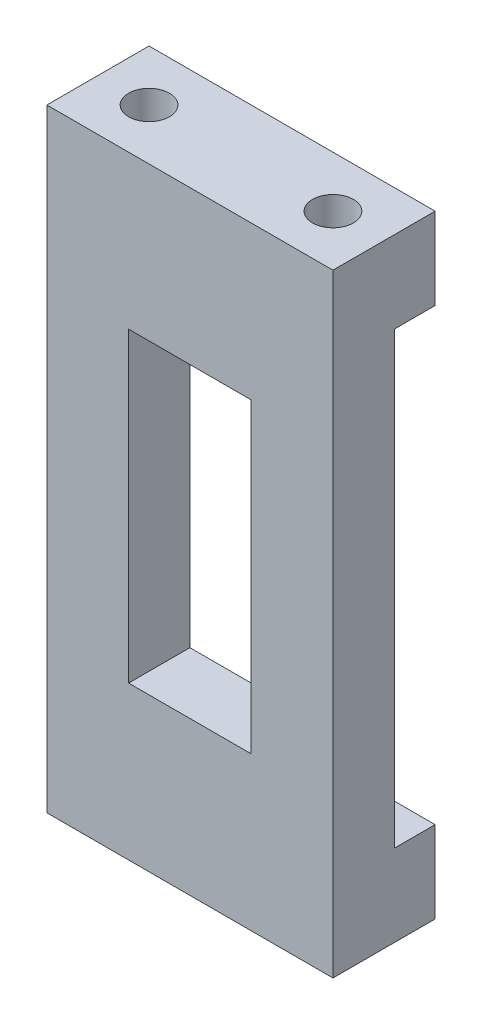
ISO-10303-21;
HEADER;
FILE_DESCRIPTION(('STEP AP214'),'2;1');
FILE_NAME('part.step','',(''),(''),'','','');
FILE_SCHEMA(('AUTOMOTIVE_DESIGN { 1 0 10303 214 1 1 1 1 }'));
ENDSEC;
DATA;
#1=APPLICATION_CONTEXT('core data for automotive mechanical design processes');
#2=APPLICATION_PROTOCOL_DEFINITION('international standard','automotive_design',2000,#1);
#3=PRODUCT_CONTEXT('',#1,'mechanical');
#4=PRODUCT('Part','Part','',(#3));
#5=PRODUCT_RELATED_PRODUCT_CATEGORY('part','',(#4));
#6=PRODUCT_DEFINITION_FORMATION('','',#4);
#7=PRODUCT_DEFINITION_CONTEXT('part definition',#1,'design');
#8=PRODUCT_DEFINITION('design','',#6,#7);
#9=PRODUCT_DEFINITION_SHAPE('','',#8);
#10=(LENGTH_UNIT() NAMED_UNIT(*) SI_UNIT(.MILLI.,.METRE.));
#11=(NAMED_UNIT(*) PLANE_ANGLE_UNIT() SI_UNIT($,.RADIAN.));
#12=(NAMED_UNIT(*) SI_UNIT($,.STERADIAN.) SOLID_ANGLE_UNIT());
#13=UNCERTAINTY_MEASURE_WITH_UNIT(LENGTH_MEASURE(1.E-05),#10,'distance_accuracy_value','');
#14=(GEOMETRIC_REPRESENTATION_CONTEXT(3) GLOBAL_UNCERTAINTY_ASSIGNED_CONTEXT((#13)) GLOBAL_UNIT_ASSIGNED_CONTEXT((#10,
#11,#12)) REPRESENTATION_CONTEXT('',''));
#15=CARTESIAN_POINT('',(0.,0.,0.));
#16=DIRECTION('',(0.,0.,1.));
#17=DIRECTION('',(1.,0.,0.));
#18=AXIS2_PLACEMENT_3D('',#15,#16,#17);
#19=CARTESIAN_POINT('',(0.,0.,-3.));
#20=DIRECTION('',(0.,0.,1.));
#21=DIRECTION('',(1.,0.,0.));
#22=AXIS2_PLACEMENT_3D('',#19,#20,#21);
#23=PLANE('',#22);
#24=DIRECTION('',(0.,-1.,0.));
#25=VECTOR('',#24,1.);
#26=CARTESIAN_POINT('',(-6.,15.,-3.));
#27=LINE('',#26,#25);
#28=CARTESIAN_POINT('',(-6.,15.,-3.));
#29=VERTEX_POINT('',#28);
#30=CARTESIAN_POINT('',(-6.,-15.,-3.));
#31=VERTEX_POINT('',#30);
#32=EDGE_CURVE('E260',#29,#31,#27,.T.);
#33=ORIENTED_EDGE('',*,*,#32,.T.);
#34=DIRECTION('',(1.,0.,0.));
#35=VECTOR('',#34,1.);
#36=CARTESIAN_POINT('',(-6.,-15.,-3.));
#37=LINE('',#36,#35);
#38=CARTESIAN_POINT('',(6.,-15.,-3.));
#39=VERTEX_POINT('',#38);
#40=EDGE_CURVE('E274',#31,#39,#37,.T.);
#41=ORIENTED_EDGE('',*,*,#40,.T.);
#42=DIRECTION('',(0.,1.,0.));
#43=VECTOR('',#42,1.);
#44=CARTESIAN_POINT('',(6.,15.,-3.));
#45=LINE('',#44,#43);
#46=CARTESIAN_POINT('',(6.,15.,-3.));
#47=VERTEX_POINT('',#46);
#48=EDGE_CURVE('E277',#39,#47,#45,.T.);
#49=ORIENTED_EDGE('',*,*,#48,.T.);
#50=DIRECTION('',(-1.,0.,0.));
#51=VECTOR('',#50,1.);
#52=CARTESIAN_POINT('',(-6.,15.,-3.));
#53=LINE('',#52,#51);
#54=EDGE_CURVE('E264',#47,#29,#53,.T.);
#55=ORIENTED_EDGE('',*,*,#54,.T.);
#56=EDGE_LOOP('',(#33,#41,#49,#55));
#57=FACE_BOUND('',#56,.T.);
#58=DIRECTION('',(0.,-1.,0.));
#59=VECTOR('',#58,1.);
#60=CARTESIAN_POINT('',(-10.7320508075689,-18.,-3.));
#61=LINE('',#60,#59);
#62=CARTESIAN_POINT('',(-10.7320508075689,-22.,-2.99999999999999));
#63=VERTEX_POINT('',#62);
#64=CARTESIAN_POINT('',(-10.7320508075689,-18.,-3.));
#65=VERTEX_POINT('',#64);
#66=EDGE_CURVE('E195',#63,#65,#61,.F.);
#67=ORIENTED_EDGE('',*,*,#66,.F.);
#68=DIRECTION('',(-1.,0.,0.));
#69=VECTOR('',#68,1.);
#70=CARTESIAN_POINT('',(14.,-22.,-2.99999999999999));
#71=LINE('',#70,#69);
#72=CARTESIAN_POINT('',(-14.,-22.,-3.));
#73=VERTEX_POINT('',#72);
#74=EDGE_CURVE('E248',#63,#73,#71,.T.);
#75=ORIENTED_EDGE('',*,*,#74,.T.);
#76=DIRECTION('',(0.,-1.,0.));
#77=VECTOR('',#76,1.);
#78=CARTESIAN_POINT('',(-14.,30.,-3.));
#79=LINE('',#78,#77);
#80=CARTESIAN_POINT('',(-14.,22.,-2.99999999999999));
#81=VERTEX_POINT('',#80);
#82=EDGE_CURVE('E291',#81,#73,#79,.T.);
#83=ORIENTED_EDGE('',*,*,#82,.F.);
#84=DIRECTION('',(-1.,0.,0.));
#85=VECTOR('',#84,1.);
#86=CARTESIAN_POINT('',(14.,22.,-2.99999999999999));
#87=LINE('',#86,#85);
#88=CARTESIAN_POINT('',(-10.7320508075689,22.,-2.99999999999999));
#89=VERTEX_POINT('',#88);
#90=EDGE_CURVE('E237',#89,#81,#87,.T.);
#91=ORIENTED_EDGE('',*,*,#90,.F.);
#92=DIRECTION('',(0.,1.,0.));
#93=VECTOR('',#92,1.);
#94=CARTESIAN_POINT('',(-10.7320508075689,18.,-3.));
#95=LINE('',#94,#93);
#96=CARTESIAN_POINT('',(-10.7320508075689,18.,-3.));
#97=VERTEX_POINT('',#96);
#98=EDGE_CURVE('E215',#89,#97,#95,.F.);
#99=ORIENTED_EDGE('',*,*,#98,.T.);
#100=DIRECTION('',(-1.,0.,0.));
#101=VECTOR('',#100,1.);
#102=CARTESIAN_POINT('',(0.,18.,-3.));
#103=LINE('',#102,#101);
#104=CARTESIAN_POINT('',(-7.26794919243112,18.,-3.));
#105=VERTEX_POINT('',#104);
#106=EDGE_CURVE('E322',#105,#97,#103,.T.);
#107=ORIENTED_EDGE('',*,*,#106,.F.);
#108=DIRECTION('',(0.,1.,0.));
#109=VECTOR('',#108,1.);
#110=CARTESIAN_POINT('',(-7.26794919243112,18.,-3.));
#111=LINE('',#110,#109);
#112=CARTESIAN_POINT('',(-7.26794919243111,22.,-2.99999999999999));
#113=VERTEX_POINT('',#112);
#114=EDGE_CURVE('E218',#105,#113,#111,.T.);
#115=ORIENTED_EDGE('',*,*,#114,.T.);
#116=CARTESIAN_POINT('',(7.26794919243111,22.,-2.99999999999999));
#117=VERTEX_POINT('',#116);
#118=EDGE_CURVE('E242',#117,#113,#87,.T.);
#119=ORIENTED_EDGE('',*,*,#118,.F.);
#120=DIRECTION('',(0.,1.,0.));
#121=VECTOR('',#120,1.);
#122=CARTESIAN_POINT('',(7.26794919243112,18.,-3.));
#123=LINE('',#122,#121);
#124=CARTESIAN_POINT('',(7.26794919243112,18.,-3.));
#125=VERTEX_POINT('',#124);
#126=EDGE_CURVE('E201',#117,#125,#123,.F.);
#127=ORIENTED_EDGE('',*,*,#126,.T.);
#128=DIRECTION('',(-1.,0.,0.));
#129=VECTOR('',#128,1.);
#130=CARTESIAN_POINT('',(0.,18.,-3.));
#131=LINE('',#130,#129);
#132=CARTESIAN_POINT('',(10.7320508075689,18.,-3.));
#133=VERTEX_POINT('',#132);
#134=EDGE_CURVE('E320',#133,#125,#131,.T.);
#135=ORIENTED_EDGE('',*,*,#134,.F.);
#136=DIRECTION('',(0.,1.,0.));
#137=VECTOR('',#136,1.);
#138=CARTESIAN_POINT('',(10.7320508075689,18.,-3.));
#139=LINE('',#138,#137);
#140=CARTESIAN_POINT('',(10.7320508075689,22.,-2.99999999999999));
#141=VERTEX_POINT('',#140);
#142=EDGE_CURVE('E212',#133,#141,#139,.T.);
#143=ORIENTED_EDGE('',*,*,#142,.T.);
#144=CARTESIAN_POINT('',(14.,22.,-2.99999999999999));
#145=VERTEX_POINT('',#144);
#146=EDGE_CURVE('E238',#145,#141,#87,.T.);
#147=ORIENTED_EDGE('',*,*,#146,.F.);
#148=DIRECTION('',(0.,1.,0.));
#149=VECTOR('',#148,1.);
#150=CARTESIAN_POINT('',(14.,30.,-3.));
#151=LINE('',#150,#149);
#152=CARTESIAN_POINT('',(14.,-22.,-2.99999999999999));
#153=VERTEX_POINT('',#152);
#154=EDGE_CURVE('E296',#153,#145,#151,.T.);
#155=ORIENTED_EDGE('',*,*,#154,.F.);
#156=CARTESIAN_POINT('',(10.7320508075689,-22.,-2.99999999999999));
#157=VERTEX_POINT('',#156);
#158=EDGE_CURVE('E187',#153,#157,#71,.T.);
#159=ORIENTED_EDGE('',*,*,#158,.T.);
#160=DIRECTION('',(0.,-1.,0.));
#161=VECTOR('',#160,1.);
#162=CARTESIAN_POINT('',(10.7320508075689,-18.,-3.));
#163=LINE('',#162,#161);
#164=CARTESIAN_POINT('',(10.7320508075689,-18.,-3.));
#165=VERTEX_POINT('',#164);
#166=EDGE_CURVE('E58',#165,#157,#163,.T.);
#167=ORIENTED_EDGE('',*,*,#166,.F.);
#168=DIRECTION('',(1.,0.,0.));
#169=VECTOR('',#168,1.);
#170=CARTESIAN_POINT('',(0.,-18.,-3.));
#171=LINE('',#170,#169);
#172=CARTESIAN_POINT('',(7.26794919243112,-18.,-3.));
#173=VERTEX_POINT('',#172);
#174=EDGE_CURVE('E43',#173,#165,#171,.T.);
#175=ORIENTED_EDGE('',*,*,#174,.F.);
#176=DIRECTION('',(0.,-1.,0.));
#177=VECTOR('',#176,1.);
#178=CARTESIAN_POINT('',(7.26794919243112,-18.,-3.));
#179=LINE('',#178,#177);
#180=CARTESIAN_POINT('',(7.26794919243112,-22.,-2.99999999999999));
#181=VERTEX_POINT('',#180);
#182=EDGE_CURVE('E179',#181,#173,#179,.F.);
#183=ORIENTED_EDGE('',*,*,#182,.F.);
#184=CARTESIAN_POINT('',(-7.26794919243112,-22.,-2.99999999999999));
#185=VERTEX_POINT('',#184);
#186=EDGE_CURVE('E254',#181,#185,#71,.T.);
#187=ORIENTED_EDGE('',*,*,#186,.T.);
#188=DIRECTION('',(0.,-1.,0.));
#189=VECTOR('',#188,1.);
#190=CARTESIAN_POINT('',(-7.26794919243112,-18.,-3.));
#191=LINE('',#190,#189);
#192=CARTESIAN_POINT('',(-7.26794919243112,-18.,-3.));
#193=VERTEX_POINT('',#192);
#194=EDGE_CURVE('E50',#193,#185,#191,.T.);
#195=ORIENTED_EDGE('',*,*,#194,.F.);
#196=DIRECTION('',(1.,0.,0.));
#197=VECTOR('',#196,1.);
#198=CARTESIAN_POINT('',(0.,-18.,-3.));
#199=LINE('',#198,#197);
#200=EDGE_CURVE('E12',#65,#193,#199,.T.);
#201=ORIENTED_EDGE('',*,*,#200,.F.);
#202=EDGE_LOOP('',(#67,#75,#83,#91,#99,#107,#115,#119,#127,#135,#143,#147,#155,#159,#167,#175,
#183,#187,#195,#201));
#203=FACE_BOUND('',#202,.T.);
#204=ADVANCED_FACE('F35',(#57,#203),#23,.F.);
#205=CARTESIAN_POINT('',(0.,0.,3.));
#206=DIRECTION('',(0.,0.,1.));
#207=DIRECTION('',(1.,0.,0.));
#208=AXIS2_PLACEMENT_3D('',#205,#206,#207);
#209=PLANE('',#208);
#210=DIRECTION('',(0.,-1.,0.));
#211=VECTOR('',#210,1.);
#212=CARTESIAN_POINT('',(-14.,30.,3.));
#213=LINE('',#212,#211);
#214=CARTESIAN_POINT('',(-14.,30.,3.));
#215=VERTEX_POINT('',#214);
#216=CARTESIAN_POINT('',(-14.,-30.,3.));
#217=VERTEX_POINT('',#216);
#218=EDGE_CURVE('E292',#215,#217,#213,.T.);
#219=ORIENTED_EDGE('',*,*,#218,.T.);
#220=DIRECTION('',(1.,0.,0.));
#221=VECTOR('',#220,1.);
#222=CARTESIAN_POINT('',(-14.,-30.,3.));
#223=LINE('',#222,#221);
#224=CARTESIAN_POINT('',(14.,-30.,3.));
#225=VERTEX_POINT('',#224);
#226=EDGE_CURVE('E295',#217,#225,#223,.T.);
#227=ORIENTED_EDGE('',*,*,#226,.T.);
#228=DIRECTION('',(0.,1.,0.));
#229=VECTOR('',#228,1.);
#230=CARTESIAN_POINT('',(14.,30.,3.));
#231=LINE('',#230,#229);
#232=CARTESIAN_POINT('',(14.,30.,3.));
#233=VERTEX_POINT('',#232);
#234=EDGE_CURVE('E298',#225,#233,#231,.T.);
#235=ORIENTED_EDGE('',*,*,#234,.T.);
#236=DIRECTION('',(-1.,0.,0.));
#237=VECTOR('',#236,1.);
#238=CARTESIAN_POINT('',(-14.,30.,3.));
#239=LINE('',#238,#237);
#240=EDGE_CURVE('E300',#233,#215,#239,.T.);
#241=ORIENTED_EDGE('',*,*,#240,.T.);
#242=EDGE_LOOP('',(#219,#227,#235,#241));
#243=FACE_BOUND('',#242,.T.);
#244=DIRECTION('',(1.,0.,0.));
#245=VECTOR('',#244,1.);
#246=CARTESIAN_POINT('',(-6.,-15.,3.));
#247=LINE('',#246,#245);
#248=CARTESIAN_POINT('',(-6.,-15.,3.));
#249=VERTEX_POINT('',#248);
#250=CARTESIAN_POINT('',(6.,-15.,3.));
#251=VERTEX_POINT('',#250);
#252=EDGE_CURVE('E263',#249,#251,#247,.T.);
#253=ORIENTED_EDGE('',*,*,#252,.F.);
#254=DIRECTION('',(0.,-1.,0.));
#255=VECTOR('',#254,1.);
#256=CARTESIAN_POINT('',(-6.,15.,3.));
#257=LINE('',#256,#255);
#258=CARTESIAN_POINT('',(-6.,15.,3.));
#259=VERTEX_POINT('',#258);
#260=EDGE_CURVE('E261',#259,#249,#257,.T.);
#261=ORIENTED_EDGE('',*,*,#260,.F.);
#262=DIRECTION('',(-1.,0.,0.));
#263=VECTOR('',#262,1.);
#264=CARTESIAN_POINT('',(-6.,15.,3.));
#265=LINE('',#264,#263);
#266=CARTESIAN_POINT('',(6.,15.,3.));
#267=VERTEX_POINT('',#266);
#268=EDGE_CURVE('E269',#267,#259,#265,.T.);
#269=ORIENTED_EDGE('',*,*,#268,.F.);
#270=DIRECTION('',(0.,1.,0.));
#271=VECTOR('',#270,1.);
#272=CARTESIAN_POINT('',(6.,15.,3.));
#273=LINE('',#272,#271);
#274=EDGE_CURVE('E266',#251,#267,#273,.T.);
#275=ORIENTED_EDGE('',*,*,#274,.F.);
#276=EDGE_LOOP('',(#253,#261,#269,#275));
#277=FACE_BOUND('',#276,.T.);
#278=ADVANCED_FACE('F379',(#243,#277),#209,.T.);
#279=CARTESIAN_POINT('',(-14.,30.,3.));
#280=DIRECTION('',(1.,0.,0.));
#281=DIRECTION('',(0.,0.,-1.));
#282=AXIS2_PLACEMENT_3D('',#279,#280,#281);
#283=PLANE('',#282);
#284=DIRECTION('',(0.,0.,-1.));
#285=VECTOR('',#284,1.);
#286=CARTESIAN_POINT('',(-14.,30.,3.));
#287=LINE('',#286,#285);
#288=CARTESIAN_POINT('',(-14.,30.,-6.99999999999999));
#289=VERTEX_POINT('',#288);
#290=EDGE_CURVE('E302',#215,#289,#287,.T.);
#291=ORIENTED_EDGE('',*,*,#290,.T.);
#292=DIRECTION('',(0.,1.,0.));
#293=VECTOR('',#292,1.);
#294=CARTESIAN_POINT('',(-14.,30.,-6.99999999999999));
#295=LINE('',#294,#293);
#296=CARTESIAN_POINT('',(-14.,22.,-6.99999999999999));
#297=VERTEX_POINT('',#296);
#298=EDGE_CURVE('E225',#297,#289,#295,.T.);
#299=ORIENTED_EDGE('',*,*,#298,.F.);
#300=DIRECTION('',(0.,0.,-1.));
#301=VECTOR('',#300,1.);
#302=CARTESIAN_POINT('',(-14.,22.,-2.99999999999999));
#303=LINE('',#302,#301);
#304=EDGE_CURVE('E221',#81,#297,#303,.T.);
#305=ORIENTED_EDGE('',*,*,#304,.F.);
#306=ORIENTED_EDGE('',*,*,#82,.T.);
#307=DIRECTION('',(0.,0.,1.));
#308=VECTOR('',#307,1.);
#309=CARTESIAN_POINT('',(-14.,-22.,-2.99999999999999));
#310=LINE('',#309,#308);
#311=CARTESIAN_POINT('',(-14.,-22.,-6.99999999999999));
#312=VERTEX_POINT('',#311);
#313=EDGE_CURVE('E246',#312,#73,#310,.T.);
#314=ORIENTED_EDGE('',*,*,#313,.F.);
#315=DIRECTION('',(0.,1.,0.));
#316=VECTOR('',#315,1.);
#317=CARTESIAN_POINT('',(-14.,-30.,-6.99999999999999));
#318=LINE('',#317,#316);
#319=CARTESIAN_POINT('',(-14.,-30.,-6.99999999999999));
#320=VERTEX_POINT('',#319);
#321=EDGE_CURVE('E241',#320,#312,#318,.T.);
#322=ORIENTED_EDGE('',*,*,#321,.F.);
#323=DIRECTION('',(0.,0.,-1.));
#324=VECTOR('',#323,1.);
#325=CARTESIAN_POINT('',(-14.,-30.,3.));
#326=LINE('',#325,#324);
#327=EDGE_CURVE('E312',#217,#320,#326,.T.);
#328=ORIENTED_EDGE('',*,*,#327,.F.);
#329=ORIENTED_EDGE('',*,*,#218,.F.);
#330=EDGE_LOOP('',(#291,#299,#305,#306,#314,#322,#328,#329));
#331=FACE_BOUND('',#330,.T.);
#332=ADVANCED_FACE('F37',(#331),#283,.F.);
#333=CARTESIAN_POINT('',(-14.,-30.,3.));
#334=DIRECTION('',(0.,1.,0.));
#335=DIRECTION('',(0.,0.,1.));
#336=AXIS2_PLACEMENT_3D('',#333,#334,#335);
#337=PLANE('',#336);
#338=CARTESIAN_POINT('',(-9.,-30.,-2.));
#339=DIRECTION('',(0.,1.,0.));
#340=DIRECTION('',(0.,0.,1.));
#341=AXIS2_PLACEMENT_3D('',#338,#339,#340);
#342=CIRCLE('',#341,2.);
#343=CARTESIAN_POINT('',(-9.,-30.,0.));
#344=VERTEX_POINT('',#343);
#345=EDGE_CURVE('E180',#344,#344,#342,.T.);
#346=ORIENTED_EDGE('',*,*,#345,.T.);
#347=EDGE_LOOP('',(#346));
#348=FACE_BOUND('',#347,.T.);
#349=CARTESIAN_POINT('',(9.,-30.,-2.));
#350=DIRECTION('',(0.,1.,0.));
#351=DIRECTION('',(0.,0.,1.));
#352=AXIS2_PLACEMENT_3D('',#349,#350,#351);
#353=CIRCLE('',#352,2.);
#354=CARTESIAN_POINT('',(9.,-30.,0.));
#355=VERTEX_POINT('',#354);
#356=EDGE_CURVE('E181',#355,#355,#353,.T.);
#357=ORIENTED_EDGE('',*,*,#356,.T.);
#358=EDGE_LOOP('',(#357));
#359=FACE_BOUND('',#358,.T.);
#360=ORIENTED_EDGE('',*,*,#327,.T.);
#361=DIRECTION('',(-1.,0.,0.));
#362=VECTOR('',#361,1.);
#363=CARTESIAN_POINT('',(14.,-30.,-6.99999999999999));
#364=LINE('',#363,#362);
#365=CARTESIAN_POINT('',(14.,-30.,-6.99999999999999));
#366=VERTEX_POINT('',#365);
#367=EDGE_CURVE('E257',#366,#320,#364,.T.);
#368=ORIENTED_EDGE('',*,*,#367,.F.);
#369=DIRECTION('',(0.,0.,-1.));
#370=VECTOR('',#369,1.);
#371=CARTESIAN_POINT('',(14.,-30.,3.));
#372=LINE('',#371,#370);
#373=EDGE_CURVE('E310',#225,#366,#372,.T.);
#374=ORIENTED_EDGE('',*,*,#373,.F.);
#375=ORIENTED_EDGE('',*,*,#226,.F.);
#376=EDGE_LOOP('',(#360,#368,#374,#375));
#377=FACE_BOUND('',#376,.T.);
#378=ADVANCED_FACE('F395',(#348,#359,#377),#337,.F.);
#379=CARTESIAN_POINT('',(14.,30.,3.));
#380=DIRECTION('',(-1.,0.,0.));
#381=DIRECTION('',(0.,0.,1.));
#382=AXIS2_PLACEMENT_3D('',#379,#380,#381);
#383=PLANE('',#382);
#384=ORIENTED_EDGE('',*,*,#373,.T.);
#385=DIRECTION('',(0.,1.,0.));
#386=VECTOR('',#385,1.);
#387=CARTESIAN_POINT('',(14.,-30.,-6.99999999999999));
#388=LINE('',#387,#386);
#389=CARTESIAN_POINT('',(14.,-22.,-6.99999999999999));
#390=VERTEX_POINT('',#389);
#391=EDGE_CURVE('E243',#366,#390,#388,.T.);
#392=ORIENTED_EDGE('',*,*,#391,.T.);
#393=DIRECTION('',(0.,0.,1.));
#394=VECTOR('',#393,1.);
#395=CARTESIAN_POINT('',(14.,-22.,-2.99999999999999));
#396=LINE('',#395,#394);
#397=EDGE_CURVE('E245',#390,#153,#396,.T.);
#398=ORIENTED_EDGE('',*,*,#397,.T.);
#399=ORIENTED_EDGE('',*,*,#154,.T.);
#400=DIRECTION('',(0.,0.,-1.));
#401=VECTOR('',#400,1.);
#402=CARTESIAN_POINT('',(14.,22.,-2.99999999999999));
#403=LINE('',#402,#401);
#404=CARTESIAN_POINT('',(14.,22.,-6.99999999999999));
#405=VERTEX_POINT('',#404);
#406=EDGE_CURVE('E222',#145,#405,#403,.T.);
#407=ORIENTED_EDGE('',*,*,#406,.T.);
#408=DIRECTION('',(0.,1.,0.));
#409=VECTOR('',#408,1.);
#410=CARTESIAN_POINT('',(14.,30.,-6.99999999999999));
#411=LINE('',#410,#409);
#412=CARTESIAN_POINT('',(14.,30.,-6.99999999999999));
#413=VERTEX_POINT('',#412);
#414=EDGE_CURVE('E224',#405,#413,#411,.T.);
#415=ORIENTED_EDGE('',*,*,#414,.T.);
#416=DIRECTION('',(0.,0.,-1.));
#417=VECTOR('',#416,1.);
#418=CARTESIAN_POINT('',(14.,30.,3.));
#419=LINE('',#418,#417);
#420=EDGE_CURVE('E308',#233,#413,#419,.T.);
#421=ORIENTED_EDGE('',*,*,#420,.F.);
#422=ORIENTED_EDGE('',*,*,#234,.F.);
#423=EDGE_LOOP('',(#384,#392,#398,#399,#407,#415,#421,#422));
#424=FACE_BOUND('',#423,.T.);
#425=ADVANCED_FACE('F339',(#424),#383,.F.);
#426=CARTESIAN_POINT('',(-14.,30.,3.));
#427=DIRECTION('',(0.,-1.,0.));
#428=DIRECTION('',(0.,0.,-1.));
#429=AXIS2_PLACEMENT_3D('',#426,#427,#428);
#430=PLANE('',#429);
#431=CARTESIAN_POINT('',(-9.,30.,-2.));
#432=DIRECTION('',(0.,1.,0.));
#433=DIRECTION('',(0.,0.,1.));
#434=AXIS2_PLACEMENT_3D('',#431,#432,#433);
#435=CIRCLE('',#434,2.);
#436=CARTESIAN_POINT('',(-9.,30.,0.));
#437=VERTEX_POINT('',#436);
#438=EDGE_CURVE('E202',#437,#437,#435,.T.);
#439=ORIENTED_EDGE('',*,*,#438,.F.);
#440=EDGE_LOOP('',(#439));
#441=FACE_BOUND('',#440,.T.);
#442=CARTESIAN_POINT('',(9.,30.,-2.));
#443=DIRECTION('',(0.,1.,0.));
#444=DIRECTION('',(0.,0.,1.));
#445=AXIS2_PLACEMENT_3D('',#442,#443,#444);
#446=CIRCLE('',#445,2.);
#447=CARTESIAN_POINT('',(9.,30.,0.));
#448=VERTEX_POINT('',#447);
#449=EDGE_CURVE('E197',#448,#448,#446,.T.);
#450=ORIENTED_EDGE('',*,*,#449,.F.);
#451=EDGE_LOOP('',(#450));
#452=FACE_BOUND('',#451,.T.);
#453=ORIENTED_EDGE('',*,*,#420,.T.);
#454=DIRECTION('',(-1.,0.,0.));
#455=VECTOR('',#454,1.);
#456=CARTESIAN_POINT('',(14.,30.,-6.99999999999999));
#457=LINE('',#456,#455);
#458=EDGE_CURVE('E228',#413,#289,#457,.T.);
#459=ORIENTED_EDGE('',*,*,#458,.T.);
#460=ORIENTED_EDGE('',*,*,#290,.F.);
#461=ORIENTED_EDGE('',*,*,#240,.F.);
#462=EDGE_LOOP('',(#453,#459,#460,#461));
#463=FACE_BOUND('',#462,.T.);
#464=ADVANCED_FACE('F389',(#441,#452,#463),#430,.F.);
#465=CARTESIAN_POINT('',(-6.,15.,3.));
#466=DIRECTION('',(1.,0.,0.));
#467=DIRECTION('',(0.,0.,-1.));
#468=AXIS2_PLACEMENT_3D('',#465,#466,#467);
#469=PLANE('',#468);
#470=ORIENTED_EDGE('',*,*,#32,.F.);
#471=DIRECTION('',(0.,0.,-1.));
#472=VECTOR('',#471,1.);
#473=CARTESIAN_POINT('',(-6.,15.,3.));
#474=LINE('',#473,#472);
#475=EDGE_CURVE('E271',#259,#29,#474,.T.);
#476=ORIENTED_EDGE('',*,*,#475,.F.);
#477=ORIENTED_EDGE('',*,*,#260,.T.);
#478=DIRECTION('',(0.,0.,-1.));
#479=VECTOR('',#478,1.);
#480=CARTESIAN_POINT('',(-6.,-15.,3.));
#481=LINE('',#480,#479);
#482=EDGE_CURVE('E288',#249,#31,#481,.T.);
#483=ORIENTED_EDGE('',*,*,#482,.T.);
#484=EDGE_LOOP('',(#470,#476,#477,#483));
#485=FACE_BOUND('',#484,.T.);
#486=ADVANCED_FACE('F392',(#485),#469,.T.);
#487=CARTESIAN_POINT('',(-6.,-15.,3.));
#488=DIRECTION('',(0.,1.,0.));
#489=DIRECTION('',(0.,0.,1.));
#490=AXIS2_PLACEMENT_3D('',#487,#488,#489);
#491=PLANE('',#490);
#492=ORIENTED_EDGE('',*,*,#40,.F.);
#493=ORIENTED_EDGE('',*,*,#482,.F.);
#494=ORIENTED_EDGE('',*,*,#252,.T.);
#495=DIRECTION('',(0.,0.,-1.));
#496=VECTOR('',#495,1.);
#497=CARTESIAN_POINT('',(6.,-15.,3.));
#498=LINE('',#497,#496);
#499=EDGE_CURVE('E286',#251,#39,#498,.T.);
#500=ORIENTED_EDGE('',*,*,#499,.T.);
#501=EDGE_LOOP('',(#492,#493,#494,#500));
#502=FACE_BOUND('',#501,.T.);
#503=ADVANCED_FACE('F438',(#502),#491,.T.);
#504=CARTESIAN_POINT('',(6.,15.,3.));
#505=DIRECTION('',(-1.,0.,0.));
#506=DIRECTION('',(0.,0.,1.));
#507=AXIS2_PLACEMENT_3D('',#504,#505,#506);
#508=PLANE('',#507);
#509=ORIENTED_EDGE('',*,*,#48,.F.);
#510=ORIENTED_EDGE('',*,*,#499,.F.);
#511=ORIENTED_EDGE('',*,*,#274,.T.);
#512=DIRECTION('',(0.,0.,-1.));
#513=VECTOR('',#512,1.);
#514=CARTESIAN_POINT('',(6.,15.,3.));
#515=LINE('',#514,#513);
#516=EDGE_CURVE('E284',#267,#47,#515,.T.);
#517=ORIENTED_EDGE('',*,*,#516,.T.);
#518=EDGE_LOOP('',(#509,#510,#511,#517));
#519=FACE_BOUND('',#518,.T.);
#520=ADVANCED_FACE('F434',(#519),#508,.T.);
#521=CARTESIAN_POINT('',(-6.,15.,3.));
#522=DIRECTION('',(0.,-1.,0.));
#523=DIRECTION('',(0.,0.,-1.));
#524=AXIS2_PLACEMENT_3D('',#521,#522,#523);
#525=PLANE('',#524);
#526=ORIENTED_EDGE('',*,*,#54,.F.);
#527=ORIENTED_EDGE('',*,*,#516,.F.);
#528=ORIENTED_EDGE('',*,*,#268,.T.);
#529=ORIENTED_EDGE('',*,*,#475,.T.);
#530=EDGE_LOOP('',(#526,#527,#528,#529));
#531=FACE_BOUND('',#530,.T.);
#532=ADVANCED_FACE('F431',(#531),#525,.T.);
#533=CARTESIAN_POINT('',(14.,-30.,-6.99999999999999));
#534=DIRECTION('',(0.,0.,1.));
#535=DIRECTION('',(0.,-1.,0.));
#536=AXIS2_PLACEMENT_3D('',#533,#534,#535);
#537=PLANE('',#536);
#538=ORIENTED_EDGE('',*,*,#321,.T.);
#539=DIRECTION('',(-1.,0.,0.));
#540=VECTOR('',#539,1.);
#541=CARTESIAN_POINT('',(14.,-22.,-6.99999999999999));
#542=LINE('',#541,#540);
#543=EDGE_CURVE('E253',#390,#312,#542,.T.);
#544=ORIENTED_EDGE('',*,*,#543,.F.);
#545=ORIENTED_EDGE('',*,*,#391,.F.);
#546=ORIENTED_EDGE('',*,*,#367,.T.);
#547=EDGE_LOOP('',(#538,#544,#545,#546));
#548=FACE_BOUND('',#547,.T.);
#549=ADVANCED_FACE('F347',(#548),#537,.F.);
#550=CARTESIAN_POINT('',(14.,-22.,-2.99999999999999));
#551=DIRECTION('',(0.,-1.,0.));
#552=DIRECTION('',(0.,0.,-1.));
#553=AXIS2_PLACEMENT_3D('',#550,#551,#552);
#554=PLANE('',#553);
#555=CARTESIAN_POINT('',(-9.,-22.,-2.));
#556=DIRECTION('',(0.,-1.,0.));
#557=DIRECTION('',(0.,0.,-1.));
#558=AXIS2_PLACEMENT_3D('',#555,#556,#557);
#559=CIRCLE('',#558,2.);
#560=EDGE_CURVE('E177',#185,#63,#559,.F.);
#561=ORIENTED_EDGE('',*,*,#560,.F.);
#562=ORIENTED_EDGE('',*,*,#186,.F.);
#563=CARTESIAN_POINT('',(9.,-22.,-2.));
#564=DIRECTION('',(0.,-1.,0.));
#565=DIRECTION('',(0.,0.,-1.));
#566=AXIS2_PLACEMENT_3D('',#563,#564,#565);
#567=CIRCLE('',#566,2.);
#568=EDGE_CURVE('E324',#157,#181,#567,.F.);
#569=ORIENTED_EDGE('',*,*,#568,.F.);
#570=ORIENTED_EDGE('',*,*,#158,.F.);
#571=ORIENTED_EDGE('',*,*,#397,.F.);
#572=ORIENTED_EDGE('',*,*,#543,.T.);
#573=ORIENTED_EDGE('',*,*,#313,.T.);
#574=ORIENTED_EDGE('',*,*,#74,.F.);
#575=EDGE_LOOP('',(#561,#562,#569,#570,#571,#572,#573,#574));
#576=FACE_BOUND('',#575,.T.);
#577=ADVANCED_FACE('F334',(#576),#554,.F.);
#578=CARTESIAN_POINT('',(14.,22.,-2.99999999999999));
#579=DIRECTION('',(0.,1.,0.));
#580=DIRECTION('',(0.,0.,1.));
#581=AXIS2_PLACEMENT_3D('',#578,#579,#580);
#582=PLANE('',#581);
#583=ORIENTED_EDGE('',*,*,#118,.T.);
#584=CARTESIAN_POINT('',(-9.,22.,-2.));
#585=DIRECTION('',(0.,1.,0.));
#586=DIRECTION('',(0.,0.,1.));
#587=AXIS2_PLACEMENT_3D('',#584,#585,#586);
#588=CIRCLE('',#587,2.);
#589=EDGE_CURVE('E317',#113,#89,#588,.T.);
#590=ORIENTED_EDGE('',*,*,#589,.T.);
#591=ORIENTED_EDGE('',*,*,#90,.T.);
#592=ORIENTED_EDGE('',*,*,#304,.T.);
#593=DIRECTION('',(-1.,0.,0.));
#594=VECTOR('',#593,1.);
#595=CARTESIAN_POINT('',(14.,22.,-6.99999999999999));
#596=LINE('',#595,#594);
#597=EDGE_CURVE('E234',#405,#297,#596,.T.);
#598=ORIENTED_EDGE('',*,*,#597,.F.);
#599=ORIENTED_EDGE('',*,*,#406,.F.);
#600=ORIENTED_EDGE('',*,*,#146,.T.);
#601=CARTESIAN_POINT('',(9.,22.,-2.));
#602=DIRECTION('',(0.,1.,0.));
#603=DIRECTION('',(0.,0.,1.));
#604=AXIS2_PLACEMENT_3D('',#601,#602,#603);
#605=CIRCLE('',#604,2.);
#606=EDGE_CURVE('E314',#141,#117,#605,.T.);
#607=ORIENTED_EDGE('',*,*,#606,.T.);
#608=EDGE_LOOP('',(#583,#590,#591,#592,#598,#599,#600,#607));
#609=FACE_BOUND('',#608,.T.);
#610=ADVANCED_FACE('F358',(#609),#582,.F.);
#611=CARTESIAN_POINT('',(14.,30.,-6.99999999999999));
#612=DIRECTION('',(0.,0.,1.));
#613=DIRECTION('',(1.,0.,0.));
#614=AXIS2_PLACEMENT_3D('',#611,#612,#613);
#615=PLANE('',#614);
#616=ORIENTED_EDGE('',*,*,#298,.T.);
#617=ORIENTED_EDGE('',*,*,#458,.F.);
#618=ORIENTED_EDGE('',*,*,#414,.F.);
#619=ORIENTED_EDGE('',*,*,#597,.T.);
#620=EDGE_LOOP('',(#616,#617,#618,#619));
#621=FACE_BOUND('',#620,.T.);
#622=ADVANCED_FACE('F416',(#621),#615,.F.);
#623=CARTESIAN_POINT('',(9.,18.,-2.));
#624=DIRECTION('',(0.,1.,0.));
#625=DIRECTION('',(0.,0.,1.));
#626=AXIS2_PLACEMENT_3D('',#623,#624,#625);
#627=PLANE('',#626);
#628=ORIENTED_EDGE('',*,*,#134,.T.);
#629=CARTESIAN_POINT('',(9.,18.,-2.));
#630=DIRECTION('',(0.,1.,0.));
#631=DIRECTION('',(0.,0.,1.));
#632=AXIS2_PLACEMENT_3D('',#629,#630,#631);
#633=CIRCLE('',#632,2.);
#634=EDGE_CURVE('E205',#125,#133,#633,.T.);
#635=ORIENTED_EDGE('',*,*,#634,.T.);
#636=EDGE_LOOP('',(#628,#635));
#637=FACE_BOUND('',#636,.T.);
#638=ADVANCED_FACE('F374',(#637),#627,.T.);
#639=CARTESIAN_POINT('',(9.,18.,-2.));
#640=DIRECTION('',(0.,1.,0.));
#641=DIRECTION('',(0.,0.,1.));
#642=AXIS2_PLACEMENT_3D('',#639,#640,#641);
#643=CYLINDRICAL_SURFACE('',#642,2.);
#644=ORIENTED_EDGE('',*,*,#449,.T.);
#645=EDGE_LOOP('',(#644));
#646=FACE_BOUND('',#645,.T.);
#647=ORIENTED_EDGE('',*,*,#634,.F.);
#648=ORIENTED_EDGE('',*,*,#126,.F.);
#649=ORIENTED_EDGE('',*,*,#606,.F.);
#650=ORIENTED_EDGE('',*,*,#142,.F.);
#651=EDGE_LOOP('',(#647,#648,#649,#650));
#652=FACE_BOUND('',#651,.T.);
#653=ADVANCED_FACE('F366',(#646,#652),#643,.F.);
#654=CARTESIAN_POINT('',(-9.,18.,-2.));
#655=DIRECTION('',(0.,1.,0.));
#656=DIRECTION('',(0.,0.,1.));
#657=AXIS2_PLACEMENT_3D('',#654,#655,#656);
#658=PLANE('',#657);
#659=ORIENTED_EDGE('',*,*,#106,.T.);
#660=CARTESIAN_POINT('',(-9.,18.,-2.));
#661=DIRECTION('',(0.,1.,0.));
#662=DIRECTION('',(0.,0.,1.));
#663=AXIS2_PLACEMENT_3D('',#660,#661,#662);
#664=CIRCLE('',#663,2.);
#665=EDGE_CURVE('E198',#97,#105,#664,.T.);
#666=ORIENTED_EDGE('',*,*,#665,.T.);
#667=EDGE_LOOP('',(#659,#666));
#668=FACE_BOUND('',#667,.T.);
#669=ADVANCED_FACE('F364',(#668),#658,.T.);
#670=CARTESIAN_POINT('',(-9.,18.,-2.));
#671=DIRECTION('',(0.,1.,0.));
#672=DIRECTION('',(0.,0.,1.));
#673=AXIS2_PLACEMENT_3D('',#670,#671,#672);
#674=CYLINDRICAL_SURFACE('',#673,2.);
#675=ORIENTED_EDGE('',*,*,#438,.T.);
#676=EDGE_LOOP('',(#675));
#677=FACE_BOUND('',#676,.T.);
#678=ORIENTED_EDGE('',*,*,#665,.F.);
#679=ORIENTED_EDGE('',*,*,#98,.F.);
#680=ORIENTED_EDGE('',*,*,#589,.F.);
#681=ORIENTED_EDGE('',*,*,#114,.F.);
#682=EDGE_LOOP('',(#678,#679,#680,#681));
#683=FACE_BOUND('',#682,.T.);
#684=ADVANCED_FACE('F362',(#677,#683),#674,.F.);
#685=CARTESIAN_POINT('',(9.,-18.,-2.));
#686=DIRECTION('',(0.,-1.,0.));
#687=DIRECTION('',(0.,0.,1.));
#688=AXIS2_PLACEMENT_3D('',#685,#686,#687);
#689=PLANE('',#688);
#690=ORIENTED_EDGE('',*,*,#174,.T.);
#691=CARTESIAN_POINT('',(9.,-18.,-2.));
#692=DIRECTION('',(0.,1.,0.));
#693=DIRECTION('',(0.,0.,1.));
#694=AXIS2_PLACEMENT_3D('',#691,#692,#693);
#695=CIRCLE('',#694,2.);
#696=EDGE_CURVE('E174',#173,#165,#695,.T.);
#697=ORIENTED_EDGE('',*,*,#696,.F.);
#698=EDGE_LOOP('',(#690,#697));
#699=FACE_BOUND('',#698,.T.);
#700=ADVANCED_FACE('F173',(#699),#689,.T.);
#701=CARTESIAN_POINT('',(9.,-18.,-2.));
#702=DIRECTION('',(0.,-1.,0.));
#703=DIRECTION('',(0.,0.,-1.));
#704=AXIS2_PLACEMENT_3D('',#701,#702,#703);
#705=CYLINDRICAL_SURFACE('',#704,2.);
#706=ORIENTED_EDGE('',*,*,#356,.F.);
#707=EDGE_LOOP('',(#706));
#708=FACE_BOUND('',#707,.T.);
#709=ORIENTED_EDGE('',*,*,#182,.T.);
#710=ORIENTED_EDGE('',*,*,#696,.T.);
#711=ORIENTED_EDGE('',*,*,#166,.T.);
#712=ORIENTED_EDGE('',*,*,#568,.T.);
#713=EDGE_LOOP('',(#709,#710,#711,#712));
#714=FACE_BOUND('',#713,.T.);
#715=ADVANCED_FACE('F178',(#708,#714),#705,.F.);
#716=CARTESIAN_POINT('',(-9.,-18.,-2.));
#717=DIRECTION('',(0.,-1.,0.));
#718=DIRECTION('',(0.,0.,1.));
#719=AXIS2_PLACEMENT_3D('',#716,#717,#718);
#720=PLANE('',#719);
#721=ORIENTED_EDGE('',*,*,#200,.T.);
#722=CARTESIAN_POINT('',(-9.,-18.,-2.));
#723=DIRECTION('',(0.,1.,0.));
#724=DIRECTION('',(0.,0.,1.));
#725=AXIS2_PLACEMENT_3D('',#722,#723,#724);
#726=CIRCLE('',#725,2.);
#727=EDGE_CURVE('E188',#65,#193,#726,.T.);
#728=ORIENTED_EDGE('',*,*,#727,.F.);
#729=EDGE_LOOP('',(#721,#728));
#730=FACE_BOUND('',#729,.T.);
#731=ADVANCED_FACE('F581',(#730),#720,.T.);
#732=CARTESIAN_POINT('',(-9.,-18.,-2.));
#733=DIRECTION('',(0.,-1.,0.));
#734=DIRECTION('',(0.,0.,-1.));
#735=AXIS2_PLACEMENT_3D('',#732,#733,#734);
#736=CYLINDRICAL_SURFACE('',#735,2.);
#737=ORIENTED_EDGE('',*,*,#345,.F.);
#738=EDGE_LOOP('',(#737));
#739=FACE_BOUND('',#738,.T.);
#740=ORIENTED_EDGE('',*,*,#66,.T.);
#741=ORIENTED_EDGE('',*,*,#727,.T.);
#742=ORIENTED_EDGE('',*,*,#194,.T.);
#743=ORIENTED_EDGE('',*,*,#560,.T.);
#744=EDGE_LOOP('',(#740,#741,#742,#743));
#745=FACE_BOUND('',#744,.T.);
#746=ADVANCED_FACE('F326',(#739,#745),#736,.F.);
#747=CLOSED_SHELL('',(#204,#278,#332,#378,#425,#464,#486,#503,#520,#532,#549,#577,#610,#622,
#638,#653,#669,#684,#700,#715,#731,#746));
#748=MANIFOLD_SOLID_BREP('B2',#747);
#749=ADVANCED_BREP_SHAPE_REPRESENTATION('',(#18,#748),#14);
#750=SHAPE_DEFINITION_REPRESENTATION(#9,#749);
ENDSEC;
END-ISO-10303-21;
